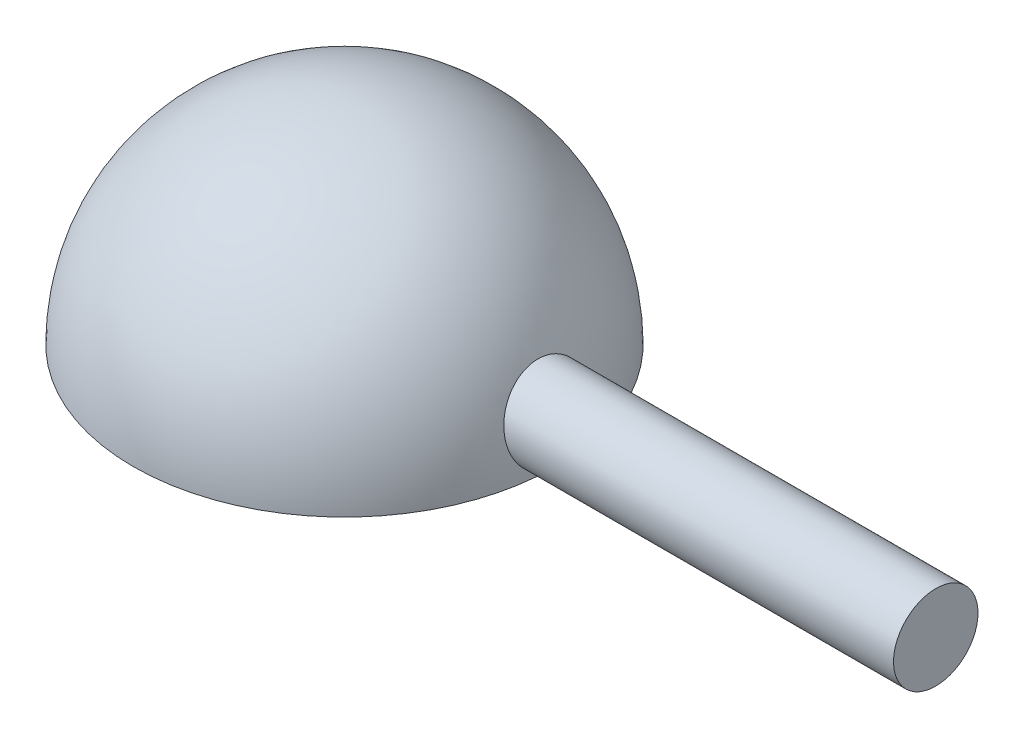
ISO-10303-21;
HEADER;
FILE_DESCRIPTION(('STEP AP214'),'2;1');
FILE_NAME('part.step','',(''),(''),'','','');
FILE_SCHEMA(('AUTOMOTIVE_DESIGN { 1 0 10303 214 1 1 1 1 }'));
ENDSEC;
DATA;
#1=APPLICATION_CONTEXT('core data for automotive mechanical design processes');
#2=APPLICATION_PROTOCOL_DEFINITION('international standard','automotive_design',2000,#1);
#3=PRODUCT_CONTEXT('',#1,'mechanical');
#4=PRODUCT('Part','Part','',(#3));
#5=PRODUCT_RELATED_PRODUCT_CATEGORY('part','',(#4));
#6=PRODUCT_DEFINITION_FORMATION('','',#4);
#7=PRODUCT_DEFINITION_CONTEXT('part definition',#1,'design');
#8=PRODUCT_DEFINITION('design','',#6,#7);
#9=PRODUCT_DEFINITION_SHAPE('','',#8);
#10=(LENGTH_UNIT() NAMED_UNIT(*) SI_UNIT(.MILLI.,.METRE.));
#11=(NAMED_UNIT(*) PLANE_ANGLE_UNIT() SI_UNIT($,.RADIAN.));
#12=(NAMED_UNIT(*) SI_UNIT($,.STERADIAN.) SOLID_ANGLE_UNIT());
#13=UNCERTAINTY_MEASURE_WITH_UNIT(LENGTH_MEASURE(1.E-05),#10,'distance_accuracy_value','');
#14=(GEOMETRIC_REPRESENTATION_CONTEXT(3) GLOBAL_UNCERTAINTY_ASSIGNED_CONTEXT((#13)) GLOBAL_UNIT_ASSIGNED_CONTEXT((#10,
#11,#12)) REPRESENTATION_CONTEXT('',''));
#15=CARTESIAN_POINT('',(0.,0.,0.));
#16=DIRECTION('',(0.,0.,1.));
#17=DIRECTION('',(1.,0.,0.));
#18=AXIS2_PLACEMENT_3D('',#15,#16,#17);
#19=CARTESIAN_POINT('',(0.,0.,0.));
#20=DIRECTION('',(0.,-1.,0.));
#21=DIRECTION('',(-1.,0.,0.));
#22=AXIS2_PLACEMENT_3D('',#19,#20,#21);
#23=SPHERICAL_SURFACE('',#22,22.);
#24=CARTESIAN_POINT('',(0.,0.,0.));
#25=DIRECTION('',(0.,-1.,0.));
#26=DIRECTION('',(1.,0.,0.));
#27=AXIS2_PLACEMENT_3D('',#24,#25,#26);
#28=CIRCLE('',#27,22.);
#29=CARTESIAN_POINT('',(22.,0.,0.));
#30=VERTEX_POINT('',#29);
#31=EDGE_CURVE('E43',#30,#30,#28,.T.);
#32=ORIENTED_EDGE('',*,*,#31,.T.);
#33=EDGE_LOOP('',(#32));
#34=FACE_BOUND('',#33,.T.);
#35=ADVANCED_FACE('F37',(#34),#23,.F.);
#36=CARTESIAN_POINT('',(0.,0.,0.));
#37=DIRECTION('',(0.,-1.,0.));
#38=DIRECTION('',(-1.,0.,0.));
#39=AXIS2_PLACEMENT_3D('',#36,#37,#38);
#40=SPHERICAL_SURFACE('',#39,25.);
#41=CARTESIAN_POINT('',(0.,0.,0.));
#42=DIRECTION('',(0.,-1.,0.));
#43=DIRECTION('',(1.,0.,0.));
#44=AXIS2_PLACEMENT_3D('',#41,#42,#43);
#45=CIRCLE('',#44,25.);
#46=CARTESIAN_POINT('',(25.,0.,0.));
#47=VERTEX_POINT('',#46);
#48=EDGE_CURVE('E11',#47,#47,#45,.T.);
#49=ORIENTED_EDGE('',*,*,#48,.F.);
#50=CARTESIAN_POINT('',(24.6796734428658,1.59137187534987,-3.6580396810126));
#51=CARTESIAN_POINT('',(24.6585359022869,1.69570539470935,-3.75526030952915));
#52=CARTESIAN_POINT('',(24.6365482559279,1.80410083084184,-3.8479208362784));
#53=CARTESIAN_POINT('',(24.59101745711,2.02823786768839,-4.02354370793574));
#54=CARTESIAN_POINT('',(24.5674738157008,2.14398177710607,-4.10650298145985));
#55=CARTESIAN_POINT('',(24.5189759557165,2.38204066482584,-4.26222271129832));
#56=CARTESIAN_POINT('',(24.4940202259322,2.50436267575854,-4.33497193972041));
#57=CARTESIAN_POINT('',(24.4428843284417,2.75460595616633,-4.46972121618427));
#58=CARTESIAN_POINT('',(24.4167037041784,2.88252931228348,-4.53171721496772));
#59=CARTESIAN_POINT('',(24.3633490782356,3.14279321506603,-4.64444423952012));
#60=CARTESIAN_POINT('',(24.3361767341565,3.27512636148128,-4.69519314259956));
#61=CARTESIAN_POINT('',(24.2809734408312,3.54350908176631,-4.78525619062332));
#62=CARTESIAN_POINT('',(24.2529421800017,3.67956000232401,-4.82456613032864));
#63=CARTESIAN_POINT('',(24.1962384118563,3.95428499657675,-4.89146755214071));
#64=CARTESIAN_POINT('',(24.1675663276691,4.09295733056587,-4.91906653948653));
#65=CARTESIAN_POINT('',(24.1097464064086,4.37209642833846,-4.96242828872197));
#66=CARTESIAN_POINT('',(24.0805983963834,4.51256384023461,-4.97818664529502));
#67=CARTESIAN_POINT('',(24.0216981034913,4.79588973721853,-4.99787300572693));
#68=CARTESIAN_POINT('',(23.9919427244448,4.9387571667149,-5.00166322492772));
#69=CARTESIAN_POINT('',(23.9323541827881,5.22433113076748,-4.99700679714209));
#70=CARTESIAN_POINT('',(23.902520995383,5.36703758581078,-4.98855560258372));
#71=CARTESIAN_POINT('',(23.8430059743239,5.65119514055027,-4.95946943340026));
#72=CARTESIAN_POINT('',(23.813324102118,5.79264656758131,-4.93883773651994));
#73=CARTESIAN_POINT('',(23.7543047630852,6.07338763964347,-4.8855154910744));
#74=CARTESIAN_POINT('',(23.7249674274663,6.21267646721747,-4.85282049294813));
#75=CARTESIAN_POINT('',(23.6667282436072,6.4886826046736,-4.7754015433584));
#76=CARTESIAN_POINT('',(23.6378290054006,6.62538521462825,-4.73062318328802));
#77=CARTESIAN_POINT('',(23.5808108901128,6.89461710638795,-4.62937594415187));
#78=CARTESIAN_POINT('',(23.5526923084875,7.02714481060053,-4.57290270551263));
#79=CARTESIAN_POINT('',(23.4974710711255,7.28696149105225,-4.44865407976935));
#80=CARTESIAN_POINT('',(23.4703680293239,7.41425245991425,-4.38088304210721));
#81=CARTESIAN_POINT('',(23.4173783354278,7.66270958201353,-4.23447861317797));
#82=CARTESIAN_POINT('',(23.3914921310614,7.78387348205543,-4.15584126499921));
#83=CARTESIAN_POINT('',(23.3164529772395,8.13454967832353,-3.90592962622759));
#84=CARTESIAN_POINT('',(23.269353764038,8.3539056300843,-3.71938109126199));
#85=CARTESIAN_POINT('',(23.1823750608564,8.7579388356968,-3.31067355102553));
#86=CARTESIAN_POINT('',(23.1424947877226,8.94261985137422,-3.08851841350818));
#87=CARTESIAN_POINT('',(23.072029018999,9.26826963379942,-2.6194872303452));
#88=CARTESIAN_POINT('',(23.0412745750369,9.41003407864025,-2.37319012824175));
#89=CARTESIAN_POINT('',(22.9891251751572,9.65008087178817,-1.85934068534083));
#90=CARTESIAN_POINT('',(22.9677289776113,9.748368988443,-1.59179116982848));
#91=CARTESIAN_POINT('',(22.9354420583853,9.89657545532486,-1.04924726284828));
#92=CARTESIAN_POINT('',(22.9243344651131,9.94749244011322,-0.774538381528851));
#93=CARTESIAN_POINT('',(22.9122458907854,10.0029026327072,-0.220267075664374));
#94=CARTESIAN_POINT('',(22.9112639980954,10.0074000197501,0.059294909677169));
#95=CARTESIAN_POINT('',(22.9194090976428,9.97007016171436,0.611600598392877));
#96=CARTESIAN_POINT('',(22.928408909495,9.92882572949091,0.884385829657576));
#97=CARTESIAN_POINT('',(22.9559890962843,9.80227526025605,1.41901893880074));
#98=CARTESIAN_POINT('',(22.9745694116169,9.71696949736939,1.68086688471387));
#99=CARTESIAN_POINT('',(23.0207170663831,9.50471159222035,2.18702639235164));
#100=CARTESIAN_POINT('',(23.0483073576434,9.37765308464062,2.43129120302834));
#101=CARTESIAN_POINT('',(23.1115247343401,9.08584198281053,2.8949881029711));
#102=CARTESIAN_POINT('',(23.147152378585,8.92108676763124,3.11441846399275));
#103=CARTESIAN_POINT('',(23.2259266816726,8.55579016885428,3.52608833836941));
#104=CARTESIAN_POINT('',(23.2691854978319,8.35471372572423,3.71783139176301));
#105=CARTESIAN_POINT('',(23.3614516722535,7.92447013403299,4.06496052762873));
#106=CARTESIAN_POINT('',(23.4104596631729,7.69529989381776,4.22034260318059));
#107=CARTESIAN_POINT('',(23.5138876751142,7.20998150427177,4.4939129773407));
#108=CARTESIAN_POINT('',(23.5684026732814,6.95335266682937,4.61121276971353));
#109=CARTESIAN_POINT('',(23.6803085951158,6.42461151066,4.8009792183356));
#110=CARTESIAN_POINT('',(23.737699816791,6.15249758711299,4.87344121847944));
#111=CARTESIAN_POINT('',(23.8547715771786,5.59533579302961,4.97262920107424));
#112=CARTESIAN_POINT('',(23.9144746562939,5.31014424749125,4.99852303176356));
#113=CARTESIAN_POINT('',(24.0335029121741,4.73942811123739,5.00135409658265));
#114=CARTESIAN_POINT('',(24.0928280683655,4.45390350337478,4.97828868790588));
#115=CARTESIAN_POINT('',(24.2098083199741,3.88886240031468,4.88343418668524));
#116=CARTESIAN_POINT('',(24.2674512814798,3.60939214491838,4.81135403318416));
#117=CARTESIAN_POINT('',(24.3790851869212,3.06633234157213,4.61993391235392));
#118=CARTESIAN_POINT('',(24.4330762179201,2.80274241504729,4.5005950721497));
#119=CARTESIAN_POINT('',(24.5354806426946,2.30127953884273,4.21888903786277));
#120=CARTESIAN_POINT('',(24.5839341081296,2.06322271381997,4.05686331274547));
#121=CARTESIAN_POINT('',(24.6743967030997,1.61761957765928,3.69350738041223));
#122=CARTESIAN_POINT('',(24.7164064016221,1.41007057273649,3.4921806470626));
#123=CARTESIAN_POINT('',(24.7732918483269,1.12843641213792,3.16720392872321));
#124=CARTESIAN_POINT('',(24.7911068976423,1.04013024510118,3.0560783375387));
#125=CARTESIAN_POINT('',(24.8247585667724,0.873164465914474,2.82653992302827));
#126=CARTESIAN_POINT('',(24.840595978936,0.7945009906112,2.70813004674967));
#127=CARTESIAN_POINT('',(24.8701820084345,0.647426611044832,2.46481851606739));
#128=CARTESIAN_POINT('',(24.883929990288,0.579018826042565,2.33991490209189));
#129=CARTESIAN_POINT('',(24.9092275700743,0.453054182571095,2.08459472992838));
#130=CARTESIAN_POINT('',(24.9207780407636,0.395493016379956,1.95418038561982));
#131=CARTESIAN_POINT('',(24.9414021291718,0.2926564204935,1.69128891344144));
#132=CARTESIAN_POINT('',(24.9505187949801,0.247167560431447,1.55889860183116));
#133=CARTESIAN_POINT('',(24.9664914724319,0.167436737858227,1.29069597378882));
#134=CARTESIAN_POINT('',(24.9733483771803,0.133190332114425,1.15488503216027));
#135=CARTESIAN_POINT('',(24.9847580117169,0.0761899696683871,0.880739178347056));
#136=CARTESIAN_POINT('',(24.9893101265201,0.0534390803068291,0.742403602707511));
#137=CARTESIAN_POINT('',(24.9960728416782,0.0196353959747366,0.464306656515208));
#138=CARTESIAN_POINT('',(24.9982843366962,0.00857813131087018,0.324545851371787));
#139=CARTESIAN_POINT('',(25.0003392665488,-0.00169624222136513,0.0463904125360264));
#140=CARTESIAN_POINT('',(25.000213060132,-0.00106514298511175,-0.0919984130554388));
#141=CARTESIAN_POINT('',(24.9976681796021,0.0116587199846711,-0.368174727214792));
#142=CARTESIAN_POINT('',(24.995250373813,0.0237471423527735,-0.505962423694326));
#143=CARTESIAN_POINT('',(24.988138679522,0.0592937961931272,-0.78008694563061));
#144=CARTESIAN_POINT('',(24.9834434373846,0.0827587895322483,-0.916422858880952));
#145=CARTESIAN_POINT('',(24.9718118499474,0.14086466947592,-1.1865421268396));
#146=CARTESIAN_POINT('',(24.9648763170041,0.175501505028682,-1.32032638821309));
#147=CARTESIAN_POINT('',(24.9488211029677,0.255638988356832,-1.58431261918408));
#148=CARTESIAN_POINT('',(24.9397037027735,0.301128290936354,-1.71451817249418));
#149=CARTESIAN_POINT('',(24.9193485511259,0.402617126329387,-1.97053959299298));
#150=CARTESIAN_POINT('',(24.9081115572957,0.458612903692103,-2.09635700968658));
#151=CARTESIAN_POINT('',(24.8836037544865,0.580641411844228,-2.34267856076481));
#152=CARTESIAN_POINT('',(24.870334782617,0.646665075992362,-2.46318736918332));
#153=CARTESIAN_POINT('',(24.841851411233,0.788262115492275,-2.69816204586077));
#154=CARTESIAN_POINT('',(24.8266375301829,0.8638329457438,-2.81262951314327));
#155=CARTESIAN_POINT('',(24.7912035010841,1.03966012119389,-3.05655187764245));
#156=CARTESIAN_POINT('',(24.7705861989648,1.14185366976036,-3.18455891447051));
#157=CARTESIAN_POINT('',(24.7269076609839,1.35805141495025,-3.42971173781286));
#158=CARTESIAN_POINT('',(24.703846450342,1.47205548969554,-3.54685763638447));
#159=CARTESIAN_POINT('',(24.6796734428658,1.59137187534987,-3.6580396810126));
#160=B_SPLINE_CURVE_WITH_KNOTS('',3,(#50,#51,#52,#53,#54,#55,#56,#57,#58,#59,#60,#61,#62,#63,
#64,#65,#66,#67,#68,#69,#70,#71,#72,#73,#74,#75,#76,#77,#78,#79,#80,#81,#82,#83,#84,#85,#86,#87,
#88,#89,#90,#91,#92,#93,#94,#95,#96,#97,#98,#99,#100,#101,#102,#103,#104,#105,#106,#107,#108,
#109,#110,#111,#112,#113,#114,#115,#116,#117,#118,#119,#120,#121,#122,#123,#124,#125,#126,#127,
#128,#129,#130,#131,#132,#133,#134,#135,#136,#137,#138,#139,#140,#141,#142,#143,#144,#145,#146,
#147,#148,#149,#150,#151,#152,#153,#154,#155,#156,#157,#158,#159),.UNSPECIFIED.,.T.,.F.,(4,2,2,
2,2,2,2,2,2,2,2,2,2,2,2,2,2,2,2,2,2,2,2,2,2,2,2,2,2,2,2,2,2,2,2,2,2,2,2,2,2,2,2,2,2,2,2,2,2,2,2,
2,2,2,4),(0.,0.432352265314396,0.864841043418093,1.29780176002113,1.73092516091135,
2.16335509222007,2.5959437949524,3.02825484279049,3.4607266527825,3.89815952912731,
4.33575494942091,4.77323266744708,5.21087191115731,5.65051561065925,6.09032349488061,
6.5299624506372,6.96976192264718,7.8404693700369,8.71108230118473,9.56439541394444,
10.4175952769321,11.2523717288091,12.087073023653,12.9112600355143,13.7354419198104,
14.5617399026684,15.3880953527926,16.2277987431268,17.0675946238708,17.9257713402073,
18.7840371575179,19.657492904973,20.5309958025328,21.4097315896979,22.2884464201789,
23.1603349320243,24.0321464113984,24.4608784553188,24.8894381709467,25.318127969412,
25.7466471537352,26.1669913196755,26.5871691570098,27.0074590509771,27.4275882380027,
27.8422652534739,28.2567852038946,28.6715518342074,29.0861682336417,29.5003530768498,
29.9143901542442,30.328055087279,30.7416099765724,31.23605550321,31.7304959279505),.UNSPECIFIED.);
#161=EDGE_CURVE('E47',#47,#47,#160,.T.);
#162=ORIENTED_EDGE('',*,*,#161,.F.);
#163=EDGE_LOOP('',(#49,#162));
#164=FACE_BOUND('',#163,.T.);
#165=ADVANCED_FACE('F68',(#164),#40,.T.);
#166=CARTESIAN_POINT('',(-25.,0.,0.));
#167=DIRECTION('',(0.,1.,0.));
#168=DIRECTION('',(-1.,0.,0.));
#169=AXIS2_PLACEMENT_3D('',#166,#167,#168);
#170=PLANE('',#169);
#171=ORIENTED_EDGE('',*,*,#31,.F.);
#172=EDGE_LOOP('',(#171));
#173=FACE_BOUND('',#172,.T.);
#174=ORIENTED_EDGE('',*,*,#48,.T.);
#175=EDGE_LOOP('',(#174));
#176=FACE_BOUND('',#175,.T.);
#177=ADVANCED_FACE('F66',(#173,#176),#170,.F.);
#178=CARTESIAN_POINT('',(-25.002,5.,0.));
#179=DIRECTION('',(1.,0.,0.));
#180=DIRECTION('',(0.,0.,-1.));
#181=AXIS2_PLACEMENT_3D('',#178,#179,#180);
#182=CYLINDRICAL_SURFACE('',#181,5.);
#183=ORIENTED_EDGE('',*,*,#161,.T.);
#184=EDGE_LOOP('',(#183));
#185=FACE_BOUND('',#184,.T.);
#186=CARTESIAN_POINT('',(70.,5.,0.));
#187=DIRECTION('',(1.,0.,0.));
#188=DIRECTION('',(0.,0.,-1.));
#189=AXIS2_PLACEMENT_3D('',#186,#187,#188);
#190=CIRCLE('',#189,5.);
#191=CARTESIAN_POINT('',(70.,5.,-5.));
#192=VERTEX_POINT('',#191);
#193=EDGE_CURVE('E52',#192,#192,#190,.T.);
#194=ORIENTED_EDGE('',*,*,#193,.F.);
#195=EDGE_LOOP('',(#194));
#196=FACE_BOUND('',#195,.T.);
#197=ADVANCED_FACE('F48',(#185,#196),#182,.T.);
#198=CARTESIAN_POINT('',(70.,5.,0.));
#199=DIRECTION('',(1.,0.,0.));
#200=DIRECTION('',(0.,0.,-1.));
#201=AXIS2_PLACEMENT_3D('',#198,#199,#200);
#202=PLANE('',#201);
#203=ORIENTED_EDGE('',*,*,#193,.T.);
#204=EDGE_LOOP('',(#203));
#205=FACE_BOUND('',#204,.T.);
#206=ADVANCED_FACE('F96',(#205),#202,.T.);
#207=CLOSED_SHELL('',(#35,#165,#177,#197,#206));
#208=MANIFOLD_SOLID_BREP('B2',#207);
#209=ADVANCED_BREP_SHAPE_REPRESENTATION('',(#18,#208),#14);
#210=SHAPE_DEFINITION_REPRESENTATION(#9,#209);
ENDSEC;
END-ISO-10303-21;
